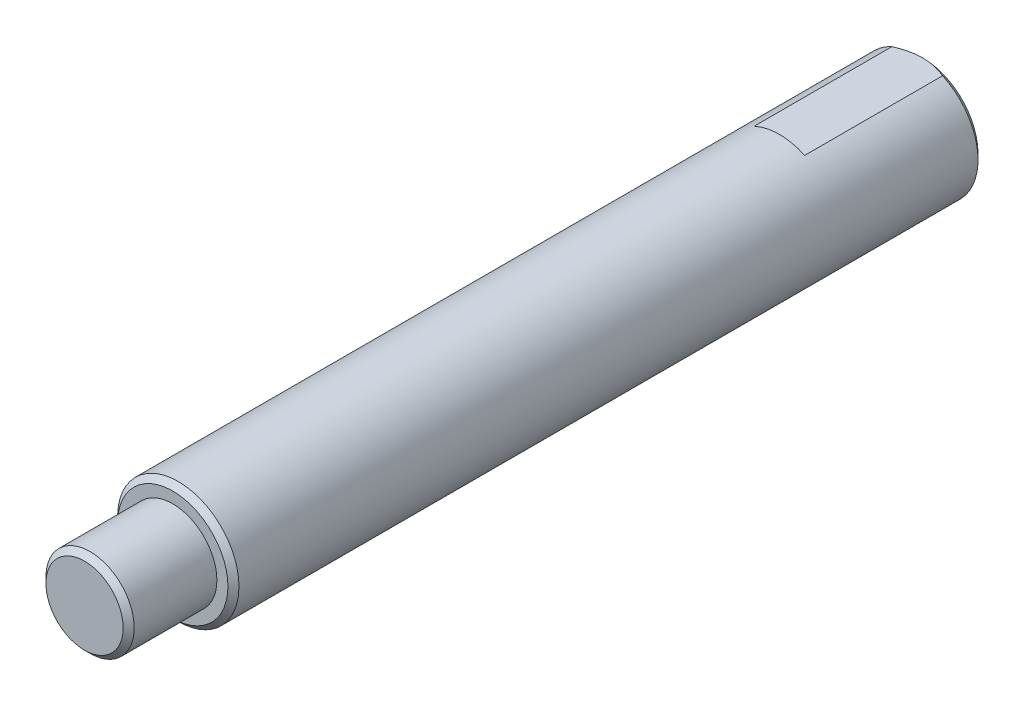
ISO-10303-21;
HEADER;
FILE_DESCRIPTION(('STEP AP214'),'2;1');
FILE_NAME('part.step','',(''),(''),'','','');
FILE_SCHEMA(('AUTOMOTIVE_DESIGN { 1 0 10303 214 1 1 1 1 }'));
ENDSEC;
DATA;
#1=APPLICATION_CONTEXT('core data for automotive mechanical design processes');
#2=APPLICATION_PROTOCOL_DEFINITION('international standard','automotive_design',2000,#1);
#3=PRODUCT_CONTEXT('',#1,'mechanical');
#4=PRODUCT('Part','Part','',(#3));
#5=PRODUCT_RELATED_PRODUCT_CATEGORY('part','',(#4));
#6=PRODUCT_DEFINITION_FORMATION('','',#4);
#7=PRODUCT_DEFINITION_CONTEXT('part definition',#1,'design');
#8=PRODUCT_DEFINITION('design','',#6,#7);
#9=PRODUCT_DEFINITION_SHAPE('','',#8);
#10=(LENGTH_UNIT() NAMED_UNIT(*) SI_UNIT(.MILLI.,.METRE.));
#11=(NAMED_UNIT(*) PLANE_ANGLE_UNIT() SI_UNIT($,.RADIAN.));
#12=(NAMED_UNIT(*) SI_UNIT($,.STERADIAN.) SOLID_ANGLE_UNIT());
#13=UNCERTAINTY_MEASURE_WITH_UNIT(LENGTH_MEASURE(1.E-05),#10,'distance_accuracy_value','');
#14=(GEOMETRIC_REPRESENTATION_CONTEXT(3) GLOBAL_UNCERTAINTY_ASSIGNED_CONTEXT((#13)) GLOBAL_UNIT_ASSIGNED_CONTEXT((#10,
#11,#12)) REPRESENTATION_CONTEXT('',''));
#15=CARTESIAN_POINT('',(0.,0.,0.));
#16=DIRECTION('',(0.,0.,1.));
#17=DIRECTION('',(1.,0.,0.));
#18=AXIS2_PLACEMENT_3D('',#15,#16,#17);
#19=CARTESIAN_POINT('',(0.,0.,0.5));
#20=DIRECTION('',(0.,0.,1.));
#21=DIRECTION('',(1.,0.,0.));
#22=AXIS2_PLACEMENT_3D('',#19,#20,#21);
#23=CONICAL_SURFACE('',#22,5.5,0.78539816339745);
#24=CARTESIAN_POINT('',(-3.59605027477684,-5.,1.1588617112842));
#25=CARTESIAN_POINT('',(-3.50570543066092,-5.,1.1061166652108));
#26=CARTESIAN_POINT('',(-3.41479612769911,-5.,1.05434027979704));
#27=CARTESIAN_POINT('',(-3.23172350305267,-5.,0.953000108204808));
#28=CARTESIAN_POINT('',(-3.13955986612801,-5.,0.903436892158468));
#29=CARTESIAN_POINT('',(-2.86034805305466,-5.,0.758144595115367));
#30=CARTESIAN_POINT('',(-2.67127970378339,-5.,0.666227476358239));
#31=CARTESIAN_POINT('',(-2.28407584772364,-5.,0.494217891562348));
#32=CARTESIAN_POINT('',(-2.08584276940194,-5.,0.414342642103682));
#33=CARTESIAN_POINT('',(-1.68330442783959,-5.,0.272400086167905));
#34=CARTESIAN_POINT('',(-1.47901002692424,-5.,0.210302823558374));
#35=CARTESIAN_POINT('',(-1.14754801322566,-5.,0.128576798986452));
#36=CARTESIAN_POINT('',(-1.02210995808063,-5.,0.101887344642856));
#37=CARTESIAN_POINT('',(-0.769641255775879,-5.,0.057363238614794));
#38=CARTESIAN_POINT('',(-0.64261053173034,-5.,0.0395290161157326));
#39=CARTESIAN_POINT('',(-0.388638018822021,-5.,0.0135039770324899));
#40=CARTESIAN_POINT('',(-0.26170450834671,-5.,0.00523313080455026));
#41=CARTESIAN_POINT('',(-0.00757349612032256,-5.,-0.00160825561373541));
#42=CARTESIAN_POINT('',(0.119624011549551,-5.,-0.000178575918312018));
#43=CARTESIAN_POINT('',(0.393277408420782,-5.,0.0133041793929305));
#44=CARTESIAN_POINT('',(0.539655207095596,-5.,0.0269731682855011));
#45=CARTESIAN_POINT('',(0.830756491663137,-5.,0.0664914605877939));
#46=CARTESIAN_POINT('',(0.975479638048462,-5.,0.0923432193399744));
#47=CARTESIAN_POINT('',(1.2642912060721,-5.,0.155416051958369));
#48=CARTESIAN_POINT('',(1.40834917898136,-5.,0.192774954808112));
#49=CARTESIAN_POINT('',(1.69350482897435,-5.,0.277253616135802));
#50=CARTESIAN_POINT('',(1.83460309803713,-5.,0.324371401809377));
#51=CARTESIAN_POINT('',(2.15286476123641,-5.,0.441248293288965));
#52=CARTESIAN_POINT('',(2.32905225093764,-5.,0.513651882306325));
#53=CARTESIAN_POINT('',(2.67664432359229,-5.,0.66923675050772));
#54=CARTESIAN_POINT('',(2.84804630257689,-5.,0.752423763590871));
#55=CARTESIAN_POINT('',(3.18703727799209,-5.,0.927569112430908));
#56=CARTESIAN_POINT('',(3.35461076438021,-5.,1.01955723478527));
#57=CARTESIAN_POINT('',(3.6858327010133,-5.,1.21023606625669));
#58=CARTESIAN_POINT('',(3.8494818590263,-5.,1.30892555426515));
#59=CARTESIAN_POINT('',(4.16588576806537,-5.,1.50692724123943));
#60=CARTESIAN_POINT('',(4.31879313955333,-5.,1.60599682317833));
#61=CARTESIAN_POINT('',(4.62198652599253,-5.,1.80808313131312));
#62=CARTESIAN_POINT('',(4.77227232695435,-5.,1.91110017755269));
#63=CARTESIAN_POINT('',(5.06930043880825,-5.,2.11945768935241));
#64=CARTESIAN_POINT('',(5.21606207293359,-5.,2.2247707056269));
#65=CARTESIAN_POINT('',(5.50761291243102,-5.,2.43801228770009));
#66=CARTESIAN_POINT('',(5.65240264981646,-5.,2.5459401252771));
#67=CARTESIAN_POINT('',(5.79637433820885,-5.,2.65493014133022));
#68=B_SPLINE_CURVE_WITH_KNOTS('',3,(#24,#25,#26,#27,#28,#29,#30,#31,#32,#33,#34,#35,#36,#37,#38,
#39,#40,#41,#42,#43,#44,#45,#46,#47,#48,#49,#50,#51,#52,#53,#54,#55,#56,#57,#58,#59,#60,#61,#62,
#63,#64,#65,#66,#67),.UNSPECIFIED.,.F.,.F.,(4,2,2,2,2,2,2,2,2,2,2,2,2,2,2,2,2,2,2,2,2,4),(0.,
0.313832173275978,0.627744731530521,1.25800962201334,1.89855009594017,2.53800481166334,
2.92247147827317,3.30695677696201,3.68820073621963,4.06945333731813,4.50993622933904,
4.95050793525073,5.39657659374412,5.84255516520684,6.41353259125289,6.98481487969808,
7.55810405253184,8.13128904071386,8.6778051629314,9.22436568850426,9.76624599967953,
10.3079770948807),.UNSPECIFIED.);
#69=CARTESIAN_POINT('',(-2.29128784747792,-5.,0.5));
#70=VERTEX_POINT('',#69);
#71=CARTESIAN_POINT('',(0.,-5.,0.));
#72=VERTEX_POINT('',#71);
#73=EDGE_CURVE('E53',#70,#72,#68,.T.);
#74=ORIENTED_EDGE('',*,*,#73,.F.);
#75=CARTESIAN_POINT('',(0.,0.,0.5));
#76=DIRECTION('',(0.,0.,1.));
#77=DIRECTION('',(1.,0.,0.));
#78=AXIS2_PLACEMENT_3D('',#75,#76,#77);
#79=CIRCLE('',#78,5.5);
#80=CARTESIAN_POINT('',(-2.29128784747792,5.,0.5));
#81=VERTEX_POINT('',#80);
#82=EDGE_CURVE('E102',#81,#70,#79,.T.);
#83=ORIENTED_EDGE('',*,*,#82,.F.);
#84=CARTESIAN_POINT('',(-3.59605027477684,5.,1.1588617112842));
#85=CARTESIAN_POINT('',(-3.50570543066092,5.,1.1061166652108));
#86=CARTESIAN_POINT('',(-3.41479612769911,5.,1.05434027979704));
#87=CARTESIAN_POINT('',(-3.23172350305267,5.,0.953000108204808));
#88=CARTESIAN_POINT('',(-3.13955986612801,5.,0.903436892158468));
#89=CARTESIAN_POINT('',(-2.86034805305466,5.,0.758144595115367));
#90=CARTESIAN_POINT('',(-2.67127970378339,5.,0.666227476358239));
#91=CARTESIAN_POINT('',(-2.28407584772364,5.,0.494217891562348));
#92=CARTESIAN_POINT('',(-2.08584276940194,5.,0.414342642103682));
#93=CARTESIAN_POINT('',(-1.68330442783959,5.,0.272400086167905));
#94=CARTESIAN_POINT('',(-1.47901002692424,5.,0.210302823558374));
#95=CARTESIAN_POINT('',(-1.14754801322566,5.,0.128576798986452));
#96=CARTESIAN_POINT('',(-1.02210995808063,5.,0.101887344642856));
#97=CARTESIAN_POINT('',(-0.769641255775879,5.,0.057363238614794));
#98=CARTESIAN_POINT('',(-0.64261053173034,5.,0.0395290161157326));
#99=CARTESIAN_POINT('',(-0.388638018822021,5.,0.0135039770324899));
#100=CARTESIAN_POINT('',(-0.26170450834671,5.,0.00523313080455026));
#101=CARTESIAN_POINT('',(-0.00757349612032256,5.,-0.00160825561373541));
#102=CARTESIAN_POINT('',(0.119624011549551,5.,-0.000178575918312018));
#103=CARTESIAN_POINT('',(0.393277408420782,5.,0.0133041793929305));
#104=CARTESIAN_POINT('',(0.539655207095596,5.,0.0269731682855011));
#105=CARTESIAN_POINT('',(0.830756491663137,5.,0.0664914605877939));
#106=CARTESIAN_POINT('',(0.975479638048462,5.,0.0923432193399744));
#107=CARTESIAN_POINT('',(1.2642912060721,5.,0.155416051958369));
#108=CARTESIAN_POINT('',(1.40834917898136,5.,0.192774954808112));
#109=CARTESIAN_POINT('',(1.69350482897435,5.,0.277253616135802));
#110=CARTESIAN_POINT('',(1.83460309803713,5.,0.324371401809377));
#111=CARTESIAN_POINT('',(2.15286476123641,5.,0.441248293288965));
#112=CARTESIAN_POINT('',(2.32905225093764,5.,0.513651882306325));
#113=CARTESIAN_POINT('',(2.67664432359229,5.,0.66923675050772));
#114=CARTESIAN_POINT('',(2.84804630257689,5.,0.752423763590871));
#115=CARTESIAN_POINT('',(3.18703727799209,5.,0.927569112430908));
#116=CARTESIAN_POINT('',(3.35461076438021,5.,1.01955723478527));
#117=CARTESIAN_POINT('',(3.6858327010133,5.,1.21023606625669));
#118=CARTESIAN_POINT('',(3.8494818590263,5.,1.30892555426515));
#119=CARTESIAN_POINT('',(4.16588576806537,5.,1.50692724123943));
#120=CARTESIAN_POINT('',(4.31879313955333,5.,1.60599682317833));
#121=CARTESIAN_POINT('',(4.62198652599253,5.,1.80808313131312));
#122=CARTESIAN_POINT('',(4.77227232695435,5.,1.91110017755269));
#123=CARTESIAN_POINT('',(5.06930043880825,5.,2.11945768935241));
#124=CARTESIAN_POINT('',(5.21606207293359,5.,2.2247707056269));
#125=CARTESIAN_POINT('',(5.50761291243102,5.,2.43801228770009));
#126=CARTESIAN_POINT('',(5.65240264981646,5.,2.5459401252771));
#127=CARTESIAN_POINT('',(5.79637433820885,5.,2.65493014133022));
#128=B_SPLINE_CURVE_WITH_KNOTS('',3,(#84,#85,#86,#87,#88,#89,#90,#91,#92,#93,#94,#95,#96,#97,
#98,#99,#100,#101,#102,#103,#104,#105,#106,#107,#108,#109,#110,#111,#112,#113,#114,#115,#116,
#117,#118,#119,#120,#121,#122,#123,#124,#125,#126,#127),.UNSPECIFIED.,.F.,.F.,(4,2,2,2,2,2,2,2,
2,2,2,2,2,2,2,2,2,2,2,2,2,4),(0.,0.313832173275978,0.627744731530521,1.25800962201334,
1.89855009594017,2.53800481166334,2.92247147827317,3.30695677696201,3.68820073621963,
4.06945333731813,4.50993622933904,4.95050793525073,5.39657659374412,5.84255516520684,
6.41353259125289,6.98481487969808,7.55810405253184,8.13128904071386,8.6778051629314,
9.22436568850426,9.76624599967953,10.3079770948807),.UNSPECIFIED.);
#129=CARTESIAN_POINT('',(0.,5.,0.));
#130=VERTEX_POINT('',#129);
#131=EDGE_CURVE('E156',#81,#130,#128,.T.);
#132=ORIENTED_EDGE('',*,*,#131,.T.);
#133=CARTESIAN_POINT('',(0.,0.,0.));
#134=DIRECTION('',(0.,0.,1.));
#135=DIRECTION('',(1.,0.,0.));
#136=AXIS2_PLACEMENT_3D('',#133,#134,#135);
#137=CIRCLE('',#136,5.);
#138=EDGE_CURVE('E130',#72,#130,#137,.F.);
#139=ORIENTED_EDGE('',*,*,#138,.F.);
#140=EDGE_LOOP('',(#74,#83,#132,#139));
#141=FACE_BOUND('',#140,.T.);
#142=ADVANCED_FACE('F38',(#141),#23,.T.);
#143=CARTESIAN_POINT('',(0.,0.,68.));
#144=DIRECTION('',(0.,0.,-1.));
#145=DIRECTION('',(-1.,0.,0.));
#146=AXIS2_PLACEMENT_3D('',#143,#144,#145);
#147=CYLINDRICAL_SURFACE('',#146,5.5);
#148=CARTESIAN_POINT('',(0.,0.,67.5));
#149=DIRECTION('',(0.,0.,1.));
#150=DIRECTION('',(1.,0.,0.));
#151=AXIS2_PLACEMENT_3D('',#148,#149,#150);
#152=CIRCLE('',#151,5.5);
#153=CARTESIAN_POINT('',(5.5,0.,67.5));
#154=VERTEX_POINT('',#153);
#155=EDGE_CURVE('E126',#154,#154,#152,.F.);
#156=ORIENTED_EDGE('',*,*,#155,.T.);
#157=EDGE_LOOP('',(#156));
#158=FACE_BOUND('',#157,.T.);
#159=CARTESIAN_POINT('',(0.,0.,13.));
#160=DIRECTION('',(0.,0.,1.));
#161=DIRECTION('',(1.,0.,0.));
#162=AXIS2_PLACEMENT_3D('',#159,#160,#161);
#163=CIRCLE('',#162,5.5);
#164=CARTESIAN_POINT('',(-2.29128784747792,-5.,13.));
#165=VERTEX_POINT('',#164);
#166=CARTESIAN_POINT('',(2.29128784747792,-5.,13.));
#167=VERTEX_POINT('',#166);
#168=EDGE_CURVE('E11',#165,#167,#163,.T.);
#169=ORIENTED_EDGE('',*,*,#168,.T.);
#170=DIRECTION('',(0.,0.,-1.));
#171=VECTOR('',#170,1.);
#172=CARTESIAN_POINT('',(2.29128784747792,-5.,68.));
#173=LINE('',#172,#171);
#174=CARTESIAN_POINT('',(2.29128784747841,-5.,0.49999999999987));
#175=VERTEX_POINT('',#174);
#176=EDGE_CURVE('E95',#167,#175,#173,.T.);
#177=ORIENTED_EDGE('',*,*,#176,.T.);
#178=CARTESIAN_POINT('',(2.29128784747792,5.,0.5));
#179=VERTEX_POINT('',#178);
#180=EDGE_CURVE('E61',#175,#179,#79,.T.);
#181=ORIENTED_EDGE('',*,*,#180,.T.);
#182=DIRECTION('',(0.,0.,-1.));
#183=VECTOR('',#182,1.);
#184=CARTESIAN_POINT('',(2.29128784747792,5.,68.));
#185=LINE('',#184,#183);
#186=CARTESIAN_POINT('',(2.29128784747792,5.,13.));
#187=VERTEX_POINT('',#186);
#188=EDGE_CURVE('E118',#187,#179,#185,.T.);
#189=ORIENTED_EDGE('',*,*,#188,.F.);
#190=CARTESIAN_POINT('',(0.,0.,13.));
#191=DIRECTION('',(0.,0.,1.));
#192=DIRECTION('',(1.,0.,0.));
#193=AXIS2_PLACEMENT_3D('',#190,#191,#192);
#194=CIRCLE('',#193,5.5);
#195=CARTESIAN_POINT('',(-2.29128784747792,5.,13.));
#196=VERTEX_POINT('',#195);
#197=EDGE_CURVE('E46',#187,#196,#194,.T.);
#198=ORIENTED_EDGE('',*,*,#197,.T.);
#199=DIRECTION('',(0.,0.,-1.));
#200=VECTOR('',#199,1.);
#201=CARTESIAN_POINT('',(-2.29128784747792,5.,68.));
#202=LINE('',#201,#200);
#203=EDGE_CURVE('E116',#81,#196,#202,.F.);
#204=ORIENTED_EDGE('',*,*,#203,.F.);
#205=ORIENTED_EDGE('',*,*,#82,.T.);
#206=DIRECTION('',(0.,0.,-1.));
#207=VECTOR('',#206,1.);
#208=CARTESIAN_POINT('',(-2.29128784747792,-5.,68.));
#209=LINE('',#208,#207);
#210=EDGE_CURVE('E94',#70,#165,#209,.F.);
#211=ORIENTED_EDGE('',*,*,#210,.T.);
#212=EDGE_LOOP('',(#169,#177,#181,#189,#198,#204,#205,#211));
#213=FACE_BOUND('',#212,.T.);
#214=ADVANCED_FACE('F99',(#158,#213),#147,.T.);
#215=EDGE_CURVE('E96',#72,#175,#68,.T.);
#216=ORIENTED_EDGE('',*,*,#215,.F.);
#217=EDGE_CURVE('E131',#130,#72,#137,.F.);
#218=ORIENTED_EDGE('',*,*,#217,.F.);
#219=EDGE_CURVE('E149',#130,#179,#128,.T.);
#220=ORIENTED_EDGE('',*,*,#219,.T.);
#221=ORIENTED_EDGE('',*,*,#180,.F.);
#222=EDGE_LOOP('',(#216,#218,#220,#221));
#223=FACE_BOUND('',#222,.T.);
#224=ADVANCED_FACE('F157',(#223),#23,.T.);
#225=CARTESIAN_POINT('',(0.,0.,68.));
#226=DIRECTION('',(0.,0.,1.));
#227=DIRECTION('',(1.,0.,0.));
#228=AXIS2_PLACEMENT_3D('',#225,#226,#227);
#229=PLANE('',#228);
#230=CARTESIAN_POINT('',(0.,0.,68.));
#231=DIRECTION('',(0.,0.,1.));
#232=DIRECTION('',(1.,0.,0.));
#233=AXIS2_PLACEMENT_3D('',#230,#231,#232);
#234=CIRCLE('',#233,5.);
#235=CARTESIAN_POINT('',(5.,0.,68.));
#236=VERTEX_POINT('',#235);
#237=EDGE_CURVE('E134',#236,#236,#234,.T.);
#238=ORIENTED_EDGE('',*,*,#237,.T.);
#239=EDGE_LOOP('',(#238));
#240=FACE_BOUND('',#239,.T.);
#241=CARTESIAN_POINT('',(0.,0.,68.));
#242=DIRECTION('',(0.,0.,1.));
#243=DIRECTION('',(1.,0.,0.));
#244=AXIS2_PLACEMENT_3D('',#241,#242,#243);
#245=CIRCLE('',#244,4.);
#246=CARTESIAN_POINT('',(4.,0.,68.));
#247=VERTEX_POINT('',#246);
#248=EDGE_CURVE('E123',#247,#247,#245,.T.);
#249=ORIENTED_EDGE('',*,*,#248,.F.);
#250=EDGE_LOOP('',(#249));
#251=FACE_BOUND('',#250,.T.);
#252=ADVANCED_FACE('F186',(#240,#251),#229,.T.);
#253=CARTESIAN_POINT('',(0.,0.,0.));
#254=DIRECTION('',(0.,0.,1.));
#255=DIRECTION('',(1.,0.,0.));
#256=AXIS2_PLACEMENT_3D('',#253,#254,#255);
#257=PLANE('',#256);
#258=CARTESIAN_POINT('',(0.,0.,0.));
#259=DIRECTION('',(0.,0.,1.));
#260=DIRECTION('',(1.,0.,0.));
#261=AXIS2_PLACEMENT_3D('',#258,#259,#260);
#262=CIRCLE('',#261,2.6);
#263=CARTESIAN_POINT('',(2.6,0.,0.));
#264=VERTEX_POINT('',#263);
#265=EDGE_CURVE('E146',#264,#264,#262,.T.);
#266=ORIENTED_EDGE('',*,*,#265,.T.);
#267=EDGE_LOOP('',(#266));
#268=FACE_BOUND('',#267,.T.);
#269=ORIENTED_EDGE('',*,*,#217,.T.);
#270=ORIENTED_EDGE('',*,*,#138,.T.);
#271=EDGE_LOOP('',(#269,#270));
#272=FACE_BOUND('',#271,.T.);
#273=ADVANCED_FACE('F189',(#268,#272),#257,.F.);
#274=CARTESIAN_POINT('',(0.,0.,68.));
#275=DIRECTION('',(0.,0.,-1.));
#276=DIRECTION('',(-1.,0.,0.));
#277=AXIS2_PLACEMENT_3D('',#274,#275,#276);
#278=CONICAL_SURFACE('',#277,5.,0.785398163397436);
#279=ORIENTED_EDGE('',*,*,#155,.F.);
#280=EDGE_LOOP('',(#279));
#281=FACE_BOUND('',#280,.T.);
#282=ORIENTED_EDGE('',*,*,#237,.F.);
#283=EDGE_LOOP('',(#282));
#284=FACE_BOUND('',#283,.T.);
#285=ADVANCED_FACE('F184',(#281,#284),#278,.T.);
#286=CARTESIAN_POINT('',(0.,0.,76.));
#287=DIRECTION('',(0.,0.,-1.));
#288=DIRECTION('',(-1.,0.,0.));
#289=AXIS2_PLACEMENT_3D('',#286,#287,#288);
#290=CYLINDRICAL_SURFACE('',#289,4.);
#291=CARTESIAN_POINT('',(0.,0.,75.5));
#292=DIRECTION('',(0.,0.,1.));
#293=DIRECTION('',(1.,0.,0.));
#294=AXIS2_PLACEMENT_3D('',#291,#292,#293);
#295=CIRCLE('',#294,4.);
#296=CARTESIAN_POINT('',(4.,0.,75.5));
#297=VERTEX_POINT('',#296);
#298=EDGE_CURVE('E140',#297,#297,#295,.F.);
#299=ORIENTED_EDGE('',*,*,#298,.T.);
#300=EDGE_LOOP('',(#299));
#301=FACE_BOUND('',#300,.T.);
#302=ORIENTED_EDGE('',*,*,#248,.T.);
#303=EDGE_LOOP('',(#302));
#304=FACE_BOUND('',#303,.T.);
#305=ADVANCED_FACE('F180',(#301,#304),#290,.T.);
#306=CARTESIAN_POINT('',(0.,0.,76.));
#307=DIRECTION('',(0.,0.,1.));
#308=DIRECTION('',(1.,0.,0.));
#309=AXIS2_PLACEMENT_3D('',#306,#307,#308);
#310=PLANE('',#309);
#311=CARTESIAN_POINT('',(0.,0.,76.));
#312=DIRECTION('',(0.,0.,1.));
#313=DIRECTION('',(1.,0.,0.));
#314=AXIS2_PLACEMENT_3D('',#311,#312,#313);
#315=CIRCLE('',#314,3.49999999999999);
#316=CARTESIAN_POINT('',(3.49999999999999,0.,76.));
#317=VERTEX_POINT('',#316);
#318=EDGE_CURVE('E137',#317,#317,#315,.T.);
#319=ORIENTED_EDGE('',*,*,#318,.T.);
#320=EDGE_LOOP('',(#319));
#321=FACE_BOUND('',#320,.T.);
#322=ADVANCED_FACE('F177',(#321),#310,.T.);
#323=CARTESIAN_POINT('',(0.,0.,76.));
#324=DIRECTION('',(0.,0.,-1.));
#325=DIRECTION('',(-1.,0.,0.));
#326=AXIS2_PLACEMENT_3D('',#323,#324,#325);
#327=CONICAL_SURFACE('',#326,3.49999999999999,0.785398163397445);
#328=ORIENTED_EDGE('',*,*,#298,.F.);
#329=EDGE_LOOP('',(#328));
#330=FACE_BOUND('',#329,.T.);
#331=ORIENTED_EDGE('',*,*,#318,.F.);
#332=EDGE_LOOP('',(#331));
#333=FACE_BOUND('',#332,.T.);
#334=ADVANCED_FACE('F175',(#330,#333),#327,.T.);
#335=CARTESIAN_POINT('',(0.,0.,12.4));
#336=DIRECTION('',(0.,0.,-1.));
#337=DIRECTION('',(-1.,0.,0.));
#338=AXIS2_PLACEMENT_3D('',#335,#336,#337);
#339=CONICAL_SURFACE('',#338,2.1,1.02974425867665);
#340=CARTESIAN_POINT('',(0.,0.,13.6618072999579));
#341=VERTEX_POINT('',#340);
#342=VERTEX_LOOP('',#341);
#343=FACE_BOUND('',#342,.T.);
#344=CARTESIAN_POINT('',(0.,0.,12.4));
#345=DIRECTION('',(0.,0.,-1.));
#346=DIRECTION('',(-1.,0.,0.));
#347=AXIS2_PLACEMENT_3D('',#344,#345,#346);
#348=CIRCLE('',#347,2.1);
#349=CARTESIAN_POINT('',(-2.1,0.,12.4));
#350=VERTEX_POINT('',#349);
#351=EDGE_CURVE('E120',#350,#350,#348,.T.);
#352=ORIENTED_EDGE('',*,*,#351,.T.);
#353=EDGE_LOOP('',(#352));
#354=FACE_BOUND('',#353,.T.);
#355=ADVANCED_FACE('F171',(#343,#354),#339,.F.);
#356=CARTESIAN_POINT('',(0.,0.,0.));
#357=DIRECTION('',(0.,0.,-1.));
#358=DIRECTION('',(-1.,0.,0.));
#359=AXIS2_PLACEMENT_3D('',#356,#357,#358);
#360=CYLINDRICAL_SURFACE('',#359,2.1);
#361=CARTESIAN_POINT('',(0.,0.,0.5));
#362=DIRECTION('',(0.,0.,1.));
#363=DIRECTION('',(1.,0.,0.));
#364=AXIS2_PLACEMENT_3D('',#361,#362,#363);
#365=CIRCLE('',#364,2.1);
#366=CARTESIAN_POINT('',(2.1,0.,0.5));
#367=VERTEX_POINT('',#366);
#368=EDGE_CURVE('E143',#367,#367,#365,.F.);
#369=ORIENTED_EDGE('',*,*,#368,.T.);
#370=EDGE_LOOP('',(#369));
#371=FACE_BOUND('',#370,.T.);
#372=ORIENTED_EDGE('',*,*,#351,.F.);
#373=EDGE_LOOP('',(#372));
#374=FACE_BOUND('',#373,.T.);
#375=ADVANCED_FACE('F168',(#371,#374),#360,.F.);
#376=CARTESIAN_POINT('',(0.,0.,0.5));
#377=DIRECTION('',(0.,0.,-1.));
#378=DIRECTION('',(-1.,0.,0.));
#379=AXIS2_PLACEMENT_3D('',#376,#377,#378);
#380=CONICAL_SURFACE('',#379,2.1,0.785398163397448);
#381=ORIENTED_EDGE('',*,*,#265,.F.);
#382=EDGE_LOOP('',(#381));
#383=FACE_BOUND('',#382,.T.);
#384=ORIENTED_EDGE('',*,*,#368,.F.);
#385=EDGE_LOOP('',(#384));
#386=FACE_BOUND('',#385,.T.);
#387=ADVANCED_FACE('F40',(#383,#386),#380,.F.);
#388=CARTESIAN_POINT('',(-5.,5.,13.));
#389=DIRECTION('',(0.,0.,1.));
#390=DIRECTION('',(1.,0.,0.));
#391=AXIS2_PLACEMENT_3D('',#388,#389,#390);
#392=PLANE('',#391);
#393=DIRECTION('',(1.,0.,0.));
#394=VECTOR('',#393,1.);
#395=CARTESIAN_POINT('',(-5.,5.,13.));
#396=LINE('',#395,#394);
#397=EDGE_CURVE('E104',#196,#187,#396,.T.);
#398=ORIENTED_EDGE('',*,*,#397,.F.);
#399=ORIENTED_EDGE('',*,*,#197,.F.);
#400=EDGE_LOOP('',(#398,#399));
#401=FACE_BOUND('',#400,.T.);
#402=ADVANCED_FACE('F166',(#401),#392,.F.);
#403=CARTESIAN_POINT('',(-5.,5.,13.));
#404=DIRECTION('',(0.,1.,0.));
#405=DIRECTION('',(0.,0.,1.));
#406=AXIS2_PLACEMENT_3D('',#403,#404,#405);
#407=PLANE('',#406);
#408=ORIENTED_EDGE('',*,*,#188,.T.);
#409=ORIENTED_EDGE('',*,*,#219,.F.);
#410=ORIENTED_EDGE('',*,*,#131,.F.);
#411=ORIENTED_EDGE('',*,*,#203,.T.);
#412=ORIENTED_EDGE('',*,*,#397,.T.);
#413=EDGE_LOOP('',(#408,#409,#410,#411,#412));
#414=FACE_BOUND('',#413,.T.);
#415=ADVANCED_FACE('F161',(#414),#407,.T.);
#416=CARTESIAN_POINT('',(-5.,-5.,13.));
#417=DIRECTION('',(0.,0.,1.));
#418=DIRECTION('',(1.,0.,0.));
#419=AXIS2_PLACEMENT_3D('',#416,#417,#418);
#420=PLANE('',#419);
#421=DIRECTION('',(1.,0.,0.));
#422=VECTOR('',#421,1.);
#423=CARTESIAN_POINT('',(-5.,-5.,13.));
#424=LINE('',#423,#422);
#425=EDGE_CURVE('E91',#165,#167,#424,.T.);
#426=ORIENTED_EDGE('',*,*,#425,.T.);
#427=ORIENTED_EDGE('',*,*,#168,.F.);
#428=EDGE_LOOP('',(#426,#427));
#429=FACE_BOUND('',#428,.T.);
#430=ADVANCED_FACE('F90',(#429),#420,.F.);
#431=CARTESIAN_POINT('',(-5.,-5.,13.));
#432=DIRECTION('',(0.,1.,0.));
#433=DIRECTION('',(0.,0.,1.));
#434=AXIS2_PLACEMENT_3D('',#431,#432,#433);
#435=PLANE('',#434);
#436=ORIENTED_EDGE('',*,*,#425,.F.);
#437=ORIENTED_EDGE('',*,*,#210,.F.);
#438=ORIENTED_EDGE('',*,*,#73,.T.);
#439=ORIENTED_EDGE('',*,*,#215,.T.);
#440=ORIENTED_EDGE('',*,*,#176,.F.);
#441=EDGE_LOOP('',(#436,#437,#438,#439,#440));
#442=FACE_BOUND('',#441,.T.);
#443=ADVANCED_FACE('F93',(#442),#435,.F.);
#444=CLOSED_SHELL('',(#142,#214,#224,#252,#273,#285,#305,#322,#334,#355,#375,#387,#402,#415,
#430,#443));
#445=MANIFOLD_SOLID_BREP('B2',#444);
#446=ADVANCED_BREP_SHAPE_REPRESENTATION('',(#18,#445),#14);
#447=SHAPE_DEFINITION_REPRESENTATION(#9,#446);
ENDSEC;
END-ISO-10303-21;
